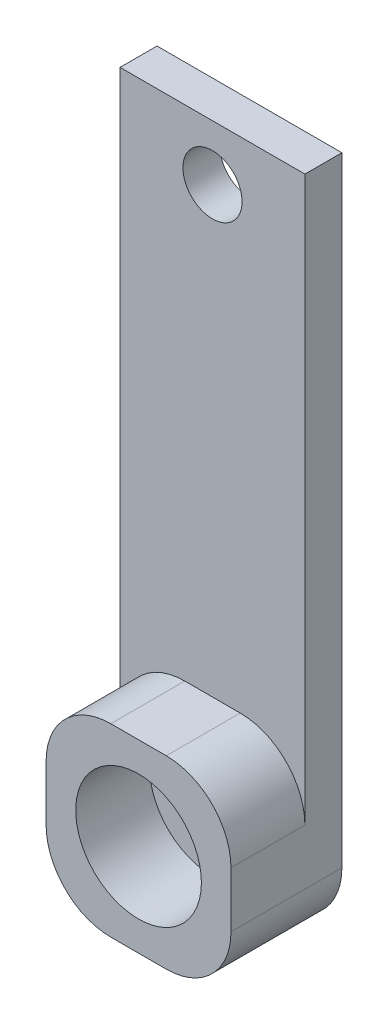
ISO-10303-21;
HEADER;
FILE_DESCRIPTION(('STEP AP214'),'2;1');
FILE_NAME('part.step','',(''),(''),'','','');
FILE_SCHEMA(('AUTOMOTIVE_DESIGN { 1 0 10303 214 1 1 1 1 }'));
ENDSEC;
DATA;
#1=APPLICATION_CONTEXT('core data for automotive mechanical design processes');
#2=APPLICATION_PROTOCOL_DEFINITION('international standard','automotive_design',2000,#1);
#3=PRODUCT_CONTEXT('',#1,'mechanical');
#4=PRODUCT('Part','Part','',(#3));
#5=PRODUCT_RELATED_PRODUCT_CATEGORY('part','',(#4));
#6=PRODUCT_DEFINITION_FORMATION('','',#4);
#7=PRODUCT_DEFINITION_CONTEXT('part definition',#1,'design');
#8=PRODUCT_DEFINITION('design','',#6,#7);
#9=PRODUCT_DEFINITION_SHAPE('','',#8);
#10=(LENGTH_UNIT() NAMED_UNIT(*) SI_UNIT(.MILLI.,.METRE.));
#11=(NAMED_UNIT(*) PLANE_ANGLE_UNIT() SI_UNIT($,.RADIAN.));
#12=(NAMED_UNIT(*) SI_UNIT($,.STERADIAN.) SOLID_ANGLE_UNIT());
#13=UNCERTAINTY_MEASURE_WITH_UNIT(LENGTH_MEASURE(1.E-05),#10,'distance_accuracy_value','');
#14=(GEOMETRIC_REPRESENTATION_CONTEXT(3) GLOBAL_UNCERTAINTY_ASSIGNED_CONTEXT((#13)) GLOBAL_UNIT_ASSIGNED_CONTEXT((#10,
#11,#12)) REPRESENTATION_CONTEXT('',''));
#15=CARTESIAN_POINT('',(0.,0.,0.));
#16=DIRECTION('',(0.,0.,1.));
#17=DIRECTION('',(1.,0.,0.));
#18=AXIS2_PLACEMENT_3D('',#15,#16,#17);
#19=CARTESIAN_POINT('',(-17.8635678666033,28.6884788398443,2.));
#20=DIRECTION('',(1.,0.,0.));
#21=DIRECTION('',(0.,1.,0.));
#22=AXIS2_PLACEMENT_3D('',#19,#20,#21);
#23=PLANE('',#22);
#24=DIRECTION('',(0.,-1.,0.));
#25=VECTOR('',#24,1.);
#26=CARTESIAN_POINT('',(-17.8635678666033,28.6884788398443,0.));
#27=LINE('',#26,#25);
#28=CARTESIAN_POINT('',(-17.8635678666033,28.6884788398443,0.));
#29=VERTEX_POINT('',#28);
#30=CARTESIAN_POINT('',(-17.8635678666033,-4.8115211601557,0.));
#31=VERTEX_POINT('',#30);
#32=EDGE_CURVE('E137',#29,#31,#27,.T.);
#33=ORIENTED_EDGE('',*,*,#32,.T.);
#34=DIRECTION('',(0.,0.,-1.));
#35=VECTOR('',#34,1.);
#36=CARTESIAN_POINT('',(-17.8635678666033,-4.8115211601557,2.));
#37=LINE('',#36,#35);
#38=CARTESIAN_POINT('',(-17.8635678666033,-4.8115211601557,6.));
#39=VERTEX_POINT('',#38);
#40=EDGE_CURVE('E159',#31,#39,#37,.F.);
#41=ORIENTED_EDGE('',*,*,#40,.T.);
#42=DIRECTION('',(0.,-1.,0.));
#43=VECTOR('',#42,1.);
#44=CARTESIAN_POINT('',(-17.8635678666033,1.68847883984431,6.));
#45=LINE('',#44,#43);
#46=CARTESIAN_POINT('',(-17.8635678666033,-1.81152116015569,6.));
#47=VERTEX_POINT('',#46);
#48=EDGE_CURVE('E157',#47,#39,#45,.T.);
#49=ORIENTED_EDGE('',*,*,#48,.F.);
#50=DIRECTION('',(0.,0.,-1.));
#51=VECTOR('',#50,1.);
#52=CARTESIAN_POINT('',(-17.8635678666033,-1.81152116015569,2.));
#53=LINE('',#52,#51);
#54=CARTESIAN_POINT('',(-17.8635678666033,-1.81152116015569,2.));
#55=VERTEX_POINT('',#54);
#56=EDGE_CURVE('E185',#47,#55,#53,.T.);
#57=ORIENTED_EDGE('',*,*,#56,.T.);
#58=DIRECTION('',(0.,-1.,0.));
#59=VECTOR('',#58,1.);
#60=CARTESIAN_POINT('',(-17.8635678666033,28.6884788398443,2.));
#61=LINE('',#60,#59);
#62=CARTESIAN_POINT('',(-17.8635678666033,28.6884788398443,2.));
#63=VERTEX_POINT('',#62);
#64=EDGE_CURVE('E114',#63,#55,#61,.T.);
#65=ORIENTED_EDGE('',*,*,#64,.F.);
#66=DIRECTION('',(0.,0.,-1.));
#67=VECTOR('',#66,1.);
#68=CARTESIAN_POINT('',(-17.8635678666033,28.6884788398443,2.));
#69=LINE('',#68,#67);
#70=EDGE_CURVE('E126',#63,#29,#69,.T.);
#71=ORIENTED_EDGE('',*,*,#70,.T.);
#72=EDGE_LOOP('',(#33,#41,#49,#57,#65,#71));
#73=FACE_BOUND('',#72,.T.);
#74=ADVANCED_FACE('F33',(#73),#23,.F.);
#75=CARTESIAN_POINT('',(-17.8635678666033,-8.3115211601557,2.));
#76=DIRECTION('',(0.,1.,0.));
#77=DIRECTION('',(0.,0.,1.));
#78=AXIS2_PLACEMENT_3D('',#75,#76,#77);
#79=PLANE('',#78);
#80=DIRECTION('',(1.,0.,0.));
#81=VECTOR('',#80,1.);
#82=CARTESIAN_POINT('',(-17.8635678666033,-8.3115211601557,0.));
#83=LINE('',#82,#81);
#84=CARTESIAN_POINT('',(-14.3635678666033,-8.3115211601557,0.));
#85=VERTEX_POINT('',#84);
#86=CARTESIAN_POINT('',(-11.3635678666033,-8.3115211601557,0.));
#87=VERTEX_POINT('',#86);
#88=EDGE_CURVE('E140',#85,#87,#83,.T.);
#89=ORIENTED_EDGE('',*,*,#88,.T.);
#90=DIRECTION('',(0.,0.,-1.));
#91=VECTOR('',#90,1.);
#92=CARTESIAN_POINT('',(-11.3635678666033,-8.3115211601557,2.));
#93=LINE('',#92,#91);
#94=CARTESIAN_POINT('',(-11.3635678666033,-8.3115211601557,6.));
#95=VERTEX_POINT('',#94);
#96=EDGE_CURVE('E190',#87,#95,#93,.F.);
#97=ORIENTED_EDGE('',*,*,#96,.T.);
#98=DIRECTION('',(1.,0.,0.));
#99=VECTOR('',#98,1.);
#100=CARTESIAN_POINT('',(-17.8635678666033,-8.3115211601557,6.));
#101=LINE('',#100,#99);
#102=CARTESIAN_POINT('',(-14.3635678666033,-8.3115211601557,6.));
#103=VERTEX_POINT('',#102);
#104=EDGE_CURVE('E200',#103,#95,#101,.T.);
#105=ORIENTED_EDGE('',*,*,#104,.F.);
#106=DIRECTION('',(0.,0.,-1.));
#107=VECTOR('',#106,1.);
#108=CARTESIAN_POINT('',(-14.3635678666033,-8.3115211601557,2.));
#109=LINE('',#108,#107);
#110=EDGE_CURVE('E205',#103,#85,#109,.T.);
#111=ORIENTED_EDGE('',*,*,#110,.T.);
#112=EDGE_LOOP('',(#89,#97,#105,#111));
#113=FACE_BOUND('',#112,.T.);
#114=ADVANCED_FACE('F226',(#113),#79,.F.);
#115=CARTESIAN_POINT('',(-7.86356786660326,28.6884788398443,2.));
#116=DIRECTION('',(-1.,0.,0.));
#117=DIRECTION('',(0.,-1.,0.));
#118=AXIS2_PLACEMENT_3D('',#115,#116,#117);
#119=PLANE('',#118);
#120=DIRECTION('',(0.,1.,0.));
#121=VECTOR('',#120,1.);
#122=CARTESIAN_POINT('',(-7.86356786660326,1.6884788398443,6.));
#123=LINE('',#122,#121);
#124=CARTESIAN_POINT('',(-7.86356786660326,-4.8115211601557,6.));
#125=VERTEX_POINT('',#124);
#126=CARTESIAN_POINT('',(-7.86356786660326,-1.8115211601557,6.));
#127=VERTEX_POINT('',#126);
#128=EDGE_CURVE('E181',#125,#127,#123,.T.);
#129=ORIENTED_EDGE('',*,*,#128,.F.);
#130=DIRECTION('',(0.,0.,-1.));
#131=VECTOR('',#130,1.);
#132=CARTESIAN_POINT('',(-7.86356786660326,-4.8115211601557,2.));
#133=LINE('',#132,#131);
#134=CARTESIAN_POINT('',(-7.86356786660326,-4.8115211601557,0.));
#135=VERTEX_POINT('',#134);
#136=EDGE_CURVE('E214',#125,#135,#133,.T.);
#137=ORIENTED_EDGE('',*,*,#136,.T.);
#138=DIRECTION('',(0.,1.,0.));
#139=VECTOR('',#138,1.);
#140=CARTESIAN_POINT('',(-7.86356786660326,28.6884788398443,0.));
#141=LINE('',#140,#139);
#142=CARTESIAN_POINT('',(-7.86356786660326,28.6884788398443,0.));
#143=VERTEX_POINT('',#142);
#144=EDGE_CURVE('E122',#135,#143,#141,.T.);
#145=ORIENTED_EDGE('',*,*,#144,.T.);
#146=DIRECTION('',(0.,0.,-1.));
#147=VECTOR('',#146,1.);
#148=CARTESIAN_POINT('',(-7.86356786660326,28.6884788398443,2.));
#149=LINE('',#148,#147);
#150=CARTESIAN_POINT('',(-7.86356786660326,28.6884788398443,2.));
#151=VERTEX_POINT('',#150);
#152=EDGE_CURVE('E117',#151,#143,#149,.T.);
#153=ORIENTED_EDGE('',*,*,#152,.F.);
#154=DIRECTION('',(0.,1.,0.));
#155=VECTOR('',#154,1.);
#156=CARTESIAN_POINT('',(-7.86356786660326,28.6884788398443,2.));
#157=LINE('',#156,#155);
#158=CARTESIAN_POINT('',(-7.86356786660326,-1.8115211601557,2.));
#159=VERTEX_POINT('',#158);
#160=EDGE_CURVE('E107',#159,#151,#157,.T.);
#161=ORIENTED_EDGE('',*,*,#160,.F.);
#162=DIRECTION('',(0.,0.,-1.));
#163=VECTOR('',#162,1.);
#164=CARTESIAN_POINT('',(-7.86356786660326,-1.81152116015569,2.));
#165=LINE('',#164,#163);
#166=EDGE_CURVE('E125',#159,#127,#165,.F.);
#167=ORIENTED_EDGE('',*,*,#166,.T.);
#168=EDGE_LOOP('',(#129,#137,#145,#153,#161,#167));
#169=FACE_BOUND('',#168,.T.);
#170=ADVANCED_FACE('F119',(#169),#119,.F.);
#171=CARTESIAN_POINT('',(-17.8635678666033,28.6884788398443,2.));
#172=DIRECTION('',(0.,-1.,0.));
#173=DIRECTION('',(0.,0.,-1.));
#174=AXIS2_PLACEMENT_3D('',#171,#172,#173);
#175=PLANE('',#174);
#176=DIRECTION('',(-1.,0.,0.));
#177=VECTOR('',#176,1.);
#178=CARTESIAN_POINT('',(-17.8635678666033,28.6884788398443,0.));
#179=LINE('',#178,#177);
#180=EDGE_CURVE('E145',#143,#29,#179,.T.);
#181=ORIENTED_EDGE('',*,*,#180,.T.);
#182=ORIENTED_EDGE('',*,*,#70,.F.);
#183=DIRECTION('',(-1.,0.,0.));
#184=VECTOR('',#183,1.);
#185=CARTESIAN_POINT('',(-17.8635678666033,28.6884788398443,2.));
#186=LINE('',#185,#184);
#187=EDGE_CURVE('E111',#151,#63,#186,.T.);
#188=ORIENTED_EDGE('',*,*,#187,.F.);
#189=ORIENTED_EDGE('',*,*,#152,.T.);
#190=EDGE_LOOP('',(#181,#182,#188,#189));
#191=FACE_BOUND('',#190,.T.);
#192=ADVANCED_FACE('F128',(#191),#175,.F.);
#193=CARTESIAN_POINT('',(0.,0.,2.));
#194=DIRECTION('',(0.,0.,1.));
#195=DIRECTION('',(1.,0.,0.));
#196=AXIS2_PLACEMENT_3D('',#193,#194,#195);
#197=PLANE('',#196);
#198=CARTESIAN_POINT('',(-12.8635678666033,25.6884788398443,2.));
#199=DIRECTION('',(0.,0.,1.));
#200=DIRECTION('',(1.,0.,0.));
#201=AXIS2_PLACEMENT_3D('',#198,#199,#200);
#202=CIRCLE('',#201,1.6);
#203=CARTESIAN_POINT('',(-11.2635678666033,25.6884788398443,2.));
#204=VERTEX_POINT('',#203);
#205=EDGE_CURVE('E376',#204,#204,#202,.T.);
#206=ORIENTED_EDGE('',*,*,#205,.F.);
#207=EDGE_LOOP('',(#206));
#208=FACE_BOUND('',#207,.T.);
#209=DIRECTION('',(-1.,0.,0.));
#210=VECTOR('',#209,1.);
#211=CARTESIAN_POINT('',(-17.8635678666033,1.68847883984431,2.));
#212=LINE('',#211,#210);
#213=CARTESIAN_POINT('',(-11.3635678666033,1.6884788398443,2.));
#214=VERTEX_POINT('',#213);
#215=CARTESIAN_POINT('',(-14.3635678666033,1.6884788398443,2.));
#216=VERTEX_POINT('',#215);
#217=EDGE_CURVE('E154',#214,#216,#212,.T.);
#218=ORIENTED_EDGE('',*,*,#217,.F.);
#219=CARTESIAN_POINT('',(-11.3635678666033,-1.8115211601557,2.));
#220=DIRECTION('',(0.,0.,1.));
#221=DIRECTION('',(1.,0.,0.));
#222=AXIS2_PLACEMENT_3D('',#219,#220,#221);
#223=CIRCLE('',#222,3.5);
#224=EDGE_CURVE('E11',#214,#159,#223,.F.);
#225=ORIENTED_EDGE('',*,*,#224,.T.);
#226=ORIENTED_EDGE('',*,*,#160,.T.);
#227=ORIENTED_EDGE('',*,*,#187,.T.);
#228=ORIENTED_EDGE('',*,*,#64,.T.);
#229=CARTESIAN_POINT('',(-14.3635678666033,-1.81152116015569,2.));
#230=DIRECTION('',(0.,0.,1.));
#231=DIRECTION('',(1.,0.,0.));
#232=AXIS2_PLACEMENT_3D('',#229,#230,#231);
#233=CIRCLE('',#232,3.5);
#234=EDGE_CURVE('E41',#55,#216,#233,.F.);
#235=ORIENTED_EDGE('',*,*,#234,.T.);
#236=EDGE_LOOP('',(#218,#225,#226,#227,#228,#235));
#237=FACE_BOUND('',#236,.T.);
#238=ADVANCED_FACE('F109',(#208,#237),#197,.T.);
#239=CARTESIAN_POINT('',(0.,0.,0.));
#240=DIRECTION('',(0.,0.,1.));
#241=DIRECTION('',(1.,0.,0.));
#242=AXIS2_PLACEMENT_3D('',#239,#240,#241);
#243=PLANE('',#242);
#244=CARTESIAN_POINT('',(-12.8635678666033,-3.3115211601557,0.));
#245=DIRECTION('',(0.,0.,1.));
#246=DIRECTION('',(1.,0.,0.));
#247=AXIS2_PLACEMENT_3D('',#244,#245,#246);
#248=CIRCLE('',#247,1.5);
#249=CARTESIAN_POINT('',(-11.3635678666033,-3.3115211601557,0.));
#250=VERTEX_POINT('',#249);
#251=EDGE_CURVE('E383',#250,#250,#248,.T.);
#252=ORIENTED_EDGE('',*,*,#251,.T.);
#253=EDGE_LOOP('',(#252));
#254=FACE_BOUND('',#253,.T.);
#255=CARTESIAN_POINT('',(-12.8635678666033,25.6884788398443,0.));
#256=DIRECTION('',(0.,0.,1.));
#257=DIRECTION('',(1.,0.,0.));
#258=AXIS2_PLACEMENT_3D('',#255,#256,#257);
#259=CIRCLE('',#258,1.6);
#260=CARTESIAN_POINT('',(-11.2635678666033,25.6884788398443,0.));
#261=VERTEX_POINT('',#260);
#262=EDGE_CURVE('E372',#261,#261,#259,.T.);
#263=ORIENTED_EDGE('',*,*,#262,.T.);
#264=EDGE_LOOP('',(#263));
#265=FACE_BOUND('',#264,.T.);
#266=ORIENTED_EDGE('',*,*,#144,.F.);
#267=CARTESIAN_POINT('',(-11.3635678666033,-4.8115211601557,0.));
#268=DIRECTION('',(0.,0.,1.));
#269=DIRECTION('',(1.,0.,0.));
#270=AXIS2_PLACEMENT_3D('',#267,#268,#269);
#271=CIRCLE('',#270,3.5);
#272=EDGE_CURVE('E209',#135,#87,#271,.F.);
#273=ORIENTED_EDGE('',*,*,#272,.T.);
#274=ORIENTED_EDGE('',*,*,#88,.F.);
#275=CARTESIAN_POINT('',(-14.3635678666033,-4.8115211601557,0.));
#276=DIRECTION('',(0.,0.,1.));
#277=DIRECTION('',(1.,0.,0.));
#278=AXIS2_PLACEMENT_3D('',#275,#276,#277);
#279=CIRCLE('',#278,3.5);
#280=EDGE_CURVE('E206',#85,#31,#279,.F.);
#281=ORIENTED_EDGE('',*,*,#280,.T.);
#282=ORIENTED_EDGE('',*,*,#32,.F.);
#283=ORIENTED_EDGE('',*,*,#180,.F.);
#284=EDGE_LOOP('',(#266,#273,#274,#281,#282,#283));
#285=FACE_BOUND('',#284,.T.);
#286=ADVANCED_FACE('F259',(#254,#265,#285),#243,.F.);
#287=CARTESIAN_POINT('',(0.,0.,6.));
#288=DIRECTION('',(0.,0.,1.));
#289=DIRECTION('',(1.,0.,0.));
#290=AXIS2_PLACEMENT_3D('',#287,#288,#289);
#291=PLANE('',#290);
#292=ORIENTED_EDGE('',*,*,#104,.T.);
#293=CARTESIAN_POINT('',(-11.3635678666033,-4.8115211601557,6.));
#294=DIRECTION('',(0.,0.,1.));
#295=DIRECTION('',(1.,0.,0.));
#296=AXIS2_PLACEMENT_3D('',#293,#294,#295);
#297=CIRCLE('',#296,3.5);
#298=EDGE_CURVE('E188',#95,#125,#297,.T.);
#299=ORIENTED_EDGE('',*,*,#298,.T.);
#300=ORIENTED_EDGE('',*,*,#128,.T.);
#301=CARTESIAN_POINT('',(-11.3635678666033,-1.8115211601557,6.));
#302=DIRECTION('',(0.,0.,1.));
#303=DIRECTION('',(1.,0.,0.));
#304=AXIS2_PLACEMENT_3D('',#301,#302,#303);
#305=CIRCLE('',#304,3.5);
#306=CARTESIAN_POINT('',(-11.3635678666033,1.6884788398443,6.));
#307=VERTEX_POINT('',#306);
#308=EDGE_CURVE('E180',#127,#307,#305,.T.);
#309=ORIENTED_EDGE('',*,*,#308,.T.);
#310=DIRECTION('',(-1.,0.,0.));
#311=VECTOR('',#310,1.);
#312=CARTESIAN_POINT('',(-17.8635678666033,1.68847883984431,6.));
#313=LINE('',#312,#311);
#314=CARTESIAN_POINT('',(-14.3635678666033,1.6884788398443,6.));
#315=VERTEX_POINT('',#314);
#316=EDGE_CURVE('E141',#307,#315,#313,.T.);
#317=ORIENTED_EDGE('',*,*,#316,.T.);
#318=CARTESIAN_POINT('',(-14.3635678666033,-1.81152116015569,6.));
#319=DIRECTION('',(0.,0.,1.));
#320=DIRECTION('',(1.,0.,0.));
#321=AXIS2_PLACEMENT_3D('',#318,#319,#320);
#322=CIRCLE('',#321,3.5);
#323=EDGE_CURVE('E176',#315,#47,#322,.T.);
#324=ORIENTED_EDGE('',*,*,#323,.T.);
#325=ORIENTED_EDGE('',*,*,#48,.T.);
#326=CARTESIAN_POINT('',(-14.3635678666033,-4.8115211601557,6.));
#327=DIRECTION('',(0.,0.,1.));
#328=DIRECTION('',(1.,0.,0.));
#329=AXIS2_PLACEMENT_3D('',#326,#327,#328);
#330=CIRCLE('',#329,3.5);
#331=EDGE_CURVE('E186',#39,#103,#330,.T.);
#332=ORIENTED_EDGE('',*,*,#331,.T.);
#333=EDGE_LOOP('',(#292,#299,#300,#309,#317,#324,#325,#332));
#334=FACE_BOUND('',#333,.T.);
#335=CARTESIAN_POINT('',(-12.8635678666033,-3.3115211601557,6.));
#336=DIRECTION('',(0.,0.,1.));
#337=DIRECTION('',(1.,0.,0.));
#338=AXIS2_PLACEMENT_3D('',#335,#336,#337);
#339=CIRCLE('',#338,3.4);
#340=CARTESIAN_POINT('',(-9.46356786660326,-3.3115211601557,6.));
#341=VERTEX_POINT('',#340);
#342=EDGE_CURVE('E158',#341,#341,#339,.T.);
#343=ORIENTED_EDGE('',*,*,#342,.F.);
#344=EDGE_LOOP('',(#343));
#345=FACE_BOUND('',#344,.T.);
#346=ADVANCED_FACE('F173',(#334,#345),#291,.T.);
#347=CARTESIAN_POINT('',(-17.8635678666033,1.68847883984431,6.));
#348=DIRECTION('',(0.,-1.,0.));
#349=DIRECTION('',(1.,0.,0.));
#350=AXIS2_PLACEMENT_3D('',#347,#348,#349);
#351=PLANE('',#350);
#352=ORIENTED_EDGE('',*,*,#217,.T.);
#353=DIRECTION('',(0.,0.,-1.));
#354=VECTOR('',#353,1.);
#355=CARTESIAN_POINT('',(-14.3635678666033,1.6884788398443,6.));
#356=LINE('',#355,#354);
#357=EDGE_CURVE('E163',#216,#315,#356,.F.);
#358=ORIENTED_EDGE('',*,*,#357,.T.);
#359=ORIENTED_EDGE('',*,*,#316,.F.);
#360=DIRECTION('',(0.,0.,-1.));
#361=VECTOR('',#360,1.);
#362=CARTESIAN_POINT('',(-11.3635678666033,1.6884788398443,6.));
#363=LINE('',#362,#361);
#364=EDGE_CURVE('E161',#307,#214,#363,.T.);
#365=ORIENTED_EDGE('',*,*,#364,.T.);
#366=EDGE_LOOP('',(#352,#358,#359,#365));
#367=FACE_BOUND('',#366,.T.);
#368=ADVANCED_FACE('F168',(#367),#351,.F.);
#369=CARTESIAN_POINT('',(-12.8635678666033,-3.3115211601557,6.));
#370=DIRECTION('',(0.,0.,-1.));
#371=DIRECTION('',(-1.,0.,0.));
#372=AXIS2_PLACEMENT_3D('',#369,#370,#371);
#373=CYLINDRICAL_SURFACE('',#372,3.4);
#374=ORIENTED_EDGE('',*,*,#342,.T.);
#375=EDGE_LOOP('',(#374));
#376=FACE_BOUND('',#375,.T.);
#377=CARTESIAN_POINT('',(-12.8635678666033,-3.3115211601557,2.));
#378=DIRECTION('',(0.,0.,1.));
#379=DIRECTION('',(1.,0.,0.));
#380=AXIS2_PLACEMENT_3D('',#377,#378,#379);
#381=CIRCLE('',#380,3.4);
#382=CARTESIAN_POINT('',(-9.46356786660326,-3.3115211601557,2.));
#383=VERTEX_POINT('',#382);
#384=EDGE_CURVE('E370',#383,#383,#381,.T.);
#385=ORIENTED_EDGE('',*,*,#384,.F.);
#386=EDGE_LOOP('',(#385));
#387=FACE_BOUND('',#386,.T.);
#388=ADVANCED_FACE('F277',(#376,#387),#373,.F.);
#389=CARTESIAN_POINT('',(-12.8635678666033,-3.3115211601557,2.));
#390=DIRECTION('',(0.,0.,1.));
#391=DIRECTION('',(1.,0.,0.));
#392=AXIS2_PLACEMENT_3D('',#389,#390,#391);
#393=CIRCLE('',#392,1.5);
#394=CARTESIAN_POINT('',(-11.3635678666033,-3.3115211601557,2.));
#395=VERTEX_POINT('',#394);
#396=EDGE_CURVE('E385',#395,#395,#393,.T.);
#397=ORIENTED_EDGE('',*,*,#396,.F.);
#398=EDGE_LOOP('',(#397));
#399=FACE_BOUND('',#398,.T.);
#400=ORIENTED_EDGE('',*,*,#384,.T.);
#401=EDGE_LOOP('',(#400));
#402=FACE_BOUND('',#401,.T.);
#403=ADVANCED_FACE('F273',(#399,#402),#197,.T.);
#404=CARTESIAN_POINT('',(-12.8635678666033,25.6884788398443,0.));
#405=DIRECTION('',(0.,0.,1.));
#406=DIRECTION('',(1.,0.,0.));
#407=AXIS2_PLACEMENT_3D('',#404,#405,#406);
#408=CYLINDRICAL_SURFACE('',#407,1.6);
#409=ORIENTED_EDGE('',*,*,#262,.F.);
#410=EDGE_LOOP('',(#409));
#411=FACE_BOUND('',#410,.T.);
#412=ORIENTED_EDGE('',*,*,#205,.T.);
#413=EDGE_LOOP('',(#412));
#414=FACE_BOUND('',#413,.T.);
#415=ADVANCED_FACE('F237',(#411,#414),#408,.F.);
#416=CARTESIAN_POINT('',(-11.3635678666033,-4.8115211601557,2.));
#417=DIRECTION('',(0.,0.,-1.));
#418=DIRECTION('',(-1.,0.,0.));
#419=AXIS2_PLACEMENT_3D('',#416,#417,#418);
#420=CYLINDRICAL_SURFACE('',#419,3.5);
#421=ORIENTED_EDGE('',*,*,#298,.F.);
#422=ORIENTED_EDGE('',*,*,#96,.F.);
#423=ORIENTED_EDGE('',*,*,#272,.F.);
#424=ORIENTED_EDGE('',*,*,#136,.F.);
#425=EDGE_LOOP('',(#421,#422,#423,#424));
#426=FACE_BOUND('',#425,.T.);
#427=ADVANCED_FACE('F234',(#426),#420,.T.);
#428=CARTESIAN_POINT('',(-14.3635678666033,-4.8115211601557,2.));
#429=DIRECTION('',(0.,0.,-1.));
#430=DIRECTION('',(-1.,0.,0.));
#431=AXIS2_PLACEMENT_3D('',#428,#429,#430);
#432=CYLINDRICAL_SURFACE('',#431,3.5);
#433=ORIENTED_EDGE('',*,*,#331,.F.);
#434=ORIENTED_EDGE('',*,*,#40,.F.);
#435=ORIENTED_EDGE('',*,*,#280,.F.);
#436=ORIENTED_EDGE('',*,*,#110,.F.);
#437=EDGE_LOOP('',(#433,#434,#435,#436));
#438=FACE_BOUND('',#437,.T.);
#439=ADVANCED_FACE('F203',(#438),#432,.T.);
#440=CARTESIAN_POINT('',(-14.3635678666033,-1.81152116015569,2.));
#441=DIRECTION('',(0.,0.,-1.));
#442=DIRECTION('',(-1.,0.,0.));
#443=AXIS2_PLACEMENT_3D('',#440,#441,#442);
#444=CYLINDRICAL_SURFACE('',#443,3.5);
#445=ORIENTED_EDGE('',*,*,#323,.F.);
#446=ORIENTED_EDGE('',*,*,#357,.F.);
#447=ORIENTED_EDGE('',*,*,#234,.F.);
#448=ORIENTED_EDGE('',*,*,#56,.F.);
#449=EDGE_LOOP('',(#445,#446,#447,#448));
#450=FACE_BOUND('',#449,.T.);
#451=ADVANCED_FACE('F183',(#450),#444,.T.);
#452=CARTESIAN_POINT('',(-11.3635678666033,-1.8115211601557,6.));
#453=DIRECTION('',(0.,0.,-1.));
#454=DIRECTION('',(-1.,0.,0.));
#455=AXIS2_PLACEMENT_3D('',#452,#453,#454);
#456=CYLINDRICAL_SURFACE('',#455,3.5);
#457=ORIENTED_EDGE('',*,*,#308,.F.);
#458=ORIENTED_EDGE('',*,*,#166,.F.);
#459=ORIENTED_EDGE('',*,*,#224,.F.);
#460=ORIENTED_EDGE('',*,*,#364,.F.);
#461=EDGE_LOOP('',(#457,#458,#459,#460));
#462=FACE_BOUND('',#461,.T.);
#463=ADVANCED_FACE('F35',(#462),#456,.T.);
#464=CARTESIAN_POINT('',(-12.8635678666033,-3.3115211601557,0.));
#465=DIRECTION('',(0.,0.,1.));
#466=DIRECTION('',(1.,0.,0.));
#467=AXIS2_PLACEMENT_3D('',#464,#465,#466);
#468=CYLINDRICAL_SURFACE('',#467,1.5);
#469=ORIENTED_EDGE('',*,*,#251,.F.);
#470=EDGE_LOOP('',(#469));
#471=FACE_BOUND('',#470,.T.);
#472=ORIENTED_EDGE('',*,*,#396,.T.);
#473=EDGE_LOOP('',(#472));
#474=FACE_BOUND('',#473,.T.);
#475=ADVANCED_FACE('F218',(#471,#474),#468,.F.);
#476=CLOSED_SHELL('',(#74,#114,#170,#192,#238,#286,#346,#368,#388,#403,#415,#427,#439,#451,#463,#475));
#477=MANIFOLD_SOLID_BREP('B2',#476);
#478=ADVANCED_BREP_SHAPE_REPRESENTATION('',(#18,#477),#14);
#479=SHAPE_DEFINITION_REPRESENTATION(#9,#478);
ENDSEC;
END-ISO-10303-21;
